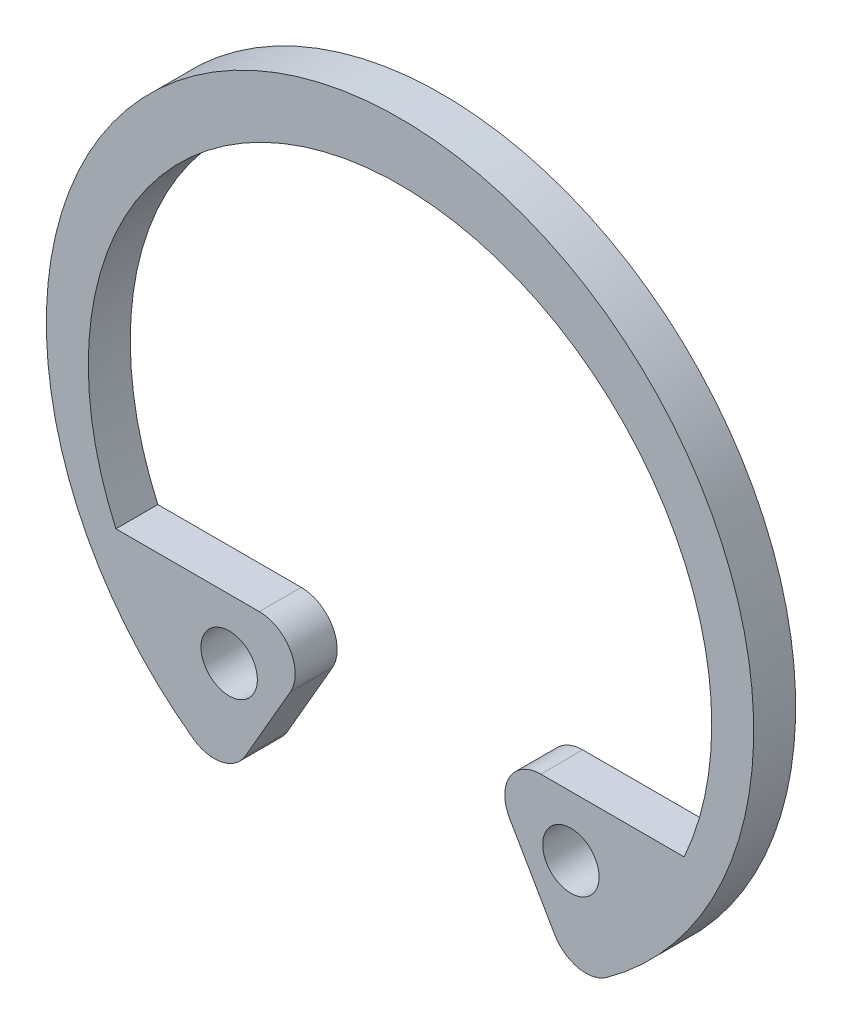
ISO-10303-21;
HEADER;
FILE_DESCRIPTION(('STEP AP214'),'2;1');
FILE_NAME('part.step','',(''),(''),'','','');
FILE_SCHEMA(('AUTOMOTIVE_DESIGN { 1 0 10303 214 1 1 1 1 }'));
ENDSEC;
DATA;
#1=APPLICATION_CONTEXT('core data for automotive mechanical design processes');
#2=APPLICATION_PROTOCOL_DEFINITION('international standard','automotive_design',2000,#1);
#3=PRODUCT_CONTEXT('',#1,'mechanical');
#4=PRODUCT('Part','Part','',(#3));
#5=PRODUCT_RELATED_PRODUCT_CATEGORY('part','',(#4));
#6=PRODUCT_DEFINITION_FORMATION('','',#4);
#7=PRODUCT_DEFINITION_CONTEXT('part definition',#1,'design');
#8=PRODUCT_DEFINITION('design','',#6,#7);
#9=PRODUCT_DEFINITION_SHAPE('','',#8);
#10=(LENGTH_UNIT() NAMED_UNIT(*) SI_UNIT(.MILLI.,.METRE.));
#11=(NAMED_UNIT(*) PLANE_ANGLE_UNIT() SI_UNIT($,.RADIAN.));
#12=(NAMED_UNIT(*) SI_UNIT($,.STERADIAN.) SOLID_ANGLE_UNIT());
#13=UNCERTAINTY_MEASURE_WITH_UNIT(LENGTH_MEASURE(1.E-05),#10,'distance_accuracy_value','');
#14=(GEOMETRIC_REPRESENTATION_CONTEXT(3) GLOBAL_UNCERTAINTY_ASSIGNED_CONTEXT((#13)) GLOBAL_UNIT_ASSIGNED_CONTEXT((#10,
#11,#12)) REPRESENTATION_CONTEXT('',''));
#15=CARTESIAN_POINT('',(0.,0.,0.));
#16=DIRECTION('',(0.,0.,1.));
#17=DIRECTION('',(1.,0.,0.));
#18=AXIS2_PLACEMENT_3D('',#15,#16,#17);
#19=CARTESIAN_POINT('',(0.,-0.3302,-0.889));
#20=DIRECTION('',(0.,0.,1.));
#21=DIRECTION('',(1.,0.,0.));
#22=AXIS2_PLACEMENT_3D('',#19,#20,#21);
#23=CYLINDRICAL_SURFACE('',#22,6.604);
#24=CARTESIAN_POINT('',(0.,-0.3302,0.));
#25=DIRECTION('',(0.,0.,-1.));
#26=DIRECTION('',(1.,0.,0.));
#27=AXIS2_PLACEMENT_3D('',#24,#25,#26);
#28=CIRCLE('',#27,6.604);
#29=CARTESIAN_POINT('',(-6.01883536574976,-3.048,0.));
#30=VERTEX_POINT('',#29);
#31=CARTESIAN_POINT('',(6.01883536574976,-3.048,0.));
#32=VERTEX_POINT('',#31);
#33=EDGE_CURVE('E143',#30,#32,#28,.T.);
#34=ORIENTED_EDGE('',*,*,#33,.F.);
#35=DIRECTION('',(0.,0.,1.));
#36=VECTOR('',#35,1.);
#37=CARTESIAN_POINT('',(-6.01883536574976,-3.048,-0.889));
#38=LINE('',#37,#36);
#39=CARTESIAN_POINT('',(-6.01883536574976,-3.048,-0.889));
#40=VERTEX_POINT('',#39);
#41=EDGE_CURVE('E11',#40,#30,#38,.T.);
#42=ORIENTED_EDGE('',*,*,#41,.F.);
#43=CARTESIAN_POINT('',(0.,-0.3302,-0.889));
#44=DIRECTION('',(0.,0.,-1.));
#45=DIRECTION('',(1.,0.,0.));
#46=AXIS2_PLACEMENT_3D('',#43,#44,#45);
#47=CIRCLE('',#46,6.604);
#48=CARTESIAN_POINT('',(6.01883536574976,-3.048,-0.889));
#49=VERTEX_POINT('',#48);
#50=EDGE_CURVE('E170',#40,#49,#47,.T.);
#51=ORIENTED_EDGE('',*,*,#50,.T.);
#52=DIRECTION('',(0.,0.,1.));
#53=VECTOR('',#52,1.);
#54=CARTESIAN_POINT('',(6.01883536574976,-3.048,-0.889));
#55=LINE('',#54,#53);
#56=EDGE_CURVE('E37',#49,#32,#55,.T.);
#57=ORIENTED_EDGE('',*,*,#56,.T.);
#58=EDGE_LOOP('',(#34,#42,#51,#57));
#59=FACE_BOUND('',#58,.T.);
#60=ADVANCED_FACE('F34',(#59),#23,.F.);
#61=CARTESIAN_POINT('',(-6.01883536574976,-3.048,-0.889));
#62=DIRECTION('',(0.,1.,0.));
#63=DIRECTION('',(-1.,0.,0.));
#64=AXIS2_PLACEMENT_3D('',#61,#62,#63);
#65=PLANE('',#64);
#66=DIRECTION('',(-1.,0.,0.));
#67=VECTOR('',#66,1.);
#68=CARTESIAN_POINT('',(-6.01883536574976,-3.048,0.));
#69=LINE('',#68,#67);
#70=CARTESIAN_POINT('',(-2.98174578531465,-3.04800000000002,0.));
#71=VERTEX_POINT('',#70);
#72=EDGE_CURVE('E168',#71,#30,#69,.T.);
#73=ORIENTED_EDGE('',*,*,#72,.F.);
#74=DIRECTION('',(0.,0.,1.));
#75=VECTOR('',#74,1.);
#76=CARTESIAN_POINT('',(-2.98174578531465,-3.04800000000002,-0.889));
#77=LINE('',#76,#75);
#78=CARTESIAN_POINT('',(-2.98174578531465,-3.04800000000002,-0.889));
#79=VERTEX_POINT('',#78);
#80=EDGE_CURVE('E43',#79,#71,#77,.T.);
#81=ORIENTED_EDGE('',*,*,#80,.F.);
#82=DIRECTION('',(-1.,0.,0.));
#83=VECTOR('',#82,1.);
#84=CARTESIAN_POINT('',(-6.01883536574976,-3.048,-0.889));
#85=LINE('',#84,#83);
#86=EDGE_CURVE('E133',#79,#40,#85,.T.);
#87=ORIENTED_EDGE('',*,*,#86,.T.);
#88=ORIENTED_EDGE('',*,*,#41,.T.);
#89=EDGE_LOOP('',(#73,#81,#87,#88));
#90=FACE_BOUND('',#89,.T.);
#91=ADVANCED_FACE('F186',(#90),#65,.T.);
#92=CARTESIAN_POINT('',(-2.98174578531465,-3.81,-0.889));
#93=DIRECTION('',(0.,0.,1.));
#94=DIRECTION('',(1.,0.,0.));
#95=AXIS2_PLACEMENT_3D('',#92,#93,#94);
#96=CYLINDRICAL_SURFACE('',#95,0.76199999999998);
#97=CARTESIAN_POINT('',(-2.98174578531465,-3.81,0.));
#98=DIRECTION('',(0.,0.,1.));
#99=DIRECTION('',(-1.,0.,0.));
#100=AXIS2_PLACEMENT_3D('',#97,#98,#99);
#101=CIRCLE('',#100,0.76199999999998);
#102=CARTESIAN_POINT('',(-2.32183442763095,-4.19099999999998,0.));
#103=VERTEX_POINT('',#102);
#104=EDGE_CURVE('E120',#103,#71,#101,.T.);
#105=ORIENTED_EDGE('',*,*,#104,.F.);
#106=DIRECTION('',(0.,0.,1.));
#107=VECTOR('',#106,1.);
#108=CARTESIAN_POINT('',(-2.32183442763095,-4.19099999999998,-0.889));
#109=LINE('',#108,#107);
#110=CARTESIAN_POINT('',(-2.32183442763095,-4.19099999999998,-0.889));
#111=VERTEX_POINT('',#110);
#112=EDGE_CURVE('E115',#111,#103,#109,.T.);
#113=ORIENTED_EDGE('',*,*,#112,.F.);
#114=CARTESIAN_POINT('',(-2.98174578531465,-3.81,-0.889));
#115=DIRECTION('',(0.,0.,1.));
#116=DIRECTION('',(-1.,0.,0.));
#117=AXIS2_PLACEMENT_3D('',#114,#115,#116);
#118=CIRCLE('',#117,0.76199999999998);
#119=EDGE_CURVE('E118',#111,#79,#118,.T.);
#120=ORIENTED_EDGE('',*,*,#119,.T.);
#121=ORIENTED_EDGE('',*,*,#80,.T.);
#122=EDGE_LOOP('',(#105,#113,#120,#121));
#123=FACE_BOUND('',#122,.T.);
#124=ADVANCED_FACE('F117',(#123),#96,.T.);
#125=CARTESIAN_POINT('',(-2.32183442763095,-4.19099999999998,-0.889));
#126=DIRECTION('',(0.866025403784436,-0.500000000000004,0.));
#127=DIRECTION('',(0.500000000000005,0.866025403784436,0.));
#128=AXIS2_PLACEMENT_3D('',#125,#126,#127);
#129=PLANE('',#128);
#130=DIRECTION('',(0.500000000000005,0.866025403784436,0.));
#131=VECTOR('',#130,1.);
#132=CARTESIAN_POINT('',(-2.32183442763095,-4.19099999999998,0.));
#133=LINE('',#132,#131);
#134=CARTESIAN_POINT('',(-3.27503972206301,-5.84199999999999,0.));
#135=VERTEX_POINT('',#134);
#136=EDGE_CURVE('E165',#135,#103,#133,.T.);
#137=ORIENTED_EDGE('',*,*,#136,.F.);
#138=DIRECTION('',(0.,0.,1.));
#139=VECTOR('',#138,1.);
#140=CARTESIAN_POINT('',(-3.27503972206301,-5.84199999999999,-0.889));
#141=LINE('',#140,#139);
#142=CARTESIAN_POINT('',(-3.27503972206301,-5.84199999999999,-0.889));
#143=VERTEX_POINT('',#142);
#144=EDGE_CURVE('E125',#143,#135,#141,.T.);
#145=ORIENTED_EDGE('',*,*,#144,.F.);
#146=DIRECTION('',(0.500000000000005,0.866025403784436,0.));
#147=VECTOR('',#146,1.);
#148=CARTESIAN_POINT('',(-2.32183442763095,-4.19099999999998,-0.889));
#149=LINE('',#148,#147);
#150=EDGE_CURVE('E131',#143,#111,#149,.T.);
#151=ORIENTED_EDGE('',*,*,#150,.T.);
#152=ORIENTED_EDGE('',*,*,#112,.T.);
#153=EDGE_LOOP('',(#137,#145,#151,#152));
#154=FACE_BOUND('',#153,.T.);
#155=ADVANCED_FACE('F135',(#154),#129,.T.);
#156=CARTESIAN_POINT('',(-3.93495107974674,-5.461,-0.889));
#157=DIRECTION('',(0.,0.,1.));
#158=DIRECTION('',(1.,0.,0.));
#159=AXIS2_PLACEMENT_3D('',#156,#157,#158);
#160=CYLINDRICAL_SURFACE('',#159,0.76199999999998);
#161=CARTESIAN_POINT('',(-3.93495107974674,-5.461,0.));
#162=DIRECTION('',(0.,0.,1.));
#163=DIRECTION('',(-1.,0.,0.));
#164=AXIS2_PLACEMENT_3D('',#161,#162,#163);
#165=CIRCLE('',#164,0.76199999999998);
#166=CARTESIAN_POINT('',(-4.38041723971807,-6.07922641509434,0.));
#167=VERTEX_POINT('',#166);
#168=EDGE_CURVE('E162',#167,#135,#165,.T.);
#169=ORIENTED_EDGE('',*,*,#168,.F.);
#170=DIRECTION('',(0.,0.,1.));
#171=VECTOR('',#170,1.);
#172=CARTESIAN_POINT('',(-4.38041723971807,-6.07922641509434,-0.889));
#173=LINE('',#172,#171);
#174=CARTESIAN_POINT('',(-4.38041723971807,-6.07922641509434,-0.889));
#175=VERTEX_POINT('',#174);
#176=EDGE_CURVE('E174',#175,#167,#173,.T.);
#177=ORIENTED_EDGE('',*,*,#176,.F.);
#178=CARTESIAN_POINT('',(-3.93495107974674,-5.461,-0.889));
#179=DIRECTION('',(0.,0.,1.));
#180=DIRECTION('',(-1.,0.,0.));
#181=AXIS2_PLACEMENT_3D('',#178,#179,#180);
#182=CIRCLE('',#181,0.76199999999998);
#183=EDGE_CURVE('E136',#175,#143,#182,.T.);
#184=ORIENTED_EDGE('',*,*,#183,.T.);
#185=ORIENTED_EDGE('',*,*,#144,.T.);
#186=EDGE_LOOP('',(#169,#177,#184,#185));
#187=FACE_BOUND('',#186,.T.);
#188=ADVANCED_FACE('F199',(#187),#160,.T.);
#189=CARTESIAN_POINT('',(0.,0.,-0.889));
#190=DIRECTION('',(0.,0.,1.));
#191=DIRECTION('',(1.,0.,0.));
#192=AXIS2_PLACEMENT_3D('',#189,#190,#191);
#193=CYLINDRICAL_SURFACE('',#192,7.493);
#194=CARTESIAN_POINT('',(0.,0.,0.));
#195=DIRECTION('',(0.,0.,1.));
#196=DIRECTION('',(1.,0.,0.));
#197=AXIS2_PLACEMENT_3D('',#194,#195,#196);
#198=CIRCLE('',#197,7.493);
#199=CARTESIAN_POINT('',(4.38041723971807,-6.07922641509434,0.));
#200=VERTEX_POINT('',#199);
#201=EDGE_CURVE('E159',#200,#167,#198,.T.);
#202=ORIENTED_EDGE('',*,*,#201,.F.);
#203=DIRECTION('',(0.,0.,1.));
#204=VECTOR('',#203,1.);
#205=CARTESIAN_POINT('',(4.38041723971807,-6.07922641509434,-0.889));
#206=LINE('',#205,#204);
#207=CARTESIAN_POINT('',(4.38041723971807,-6.07922641509434,-0.889));
#208=VERTEX_POINT('',#207);
#209=EDGE_CURVE('E176',#208,#200,#206,.T.);
#210=ORIENTED_EDGE('',*,*,#209,.F.);
#211=CARTESIAN_POINT('',(0.,0.,-0.889));
#212=DIRECTION('',(0.,0.,1.));
#213=DIRECTION('',(1.,0.,0.));
#214=AXIS2_PLACEMENT_3D('',#211,#212,#213);
#215=CIRCLE('',#214,7.493);
#216=EDGE_CURVE('E138',#208,#175,#215,.T.);
#217=ORIENTED_EDGE('',*,*,#216,.T.);
#218=ORIENTED_EDGE('',*,*,#176,.T.);
#219=EDGE_LOOP('',(#202,#210,#217,#218));
#220=FACE_BOUND('',#219,.T.);
#221=ADVANCED_FACE('F202',(#220),#193,.T.);
#222=CARTESIAN_POINT('',(3.93495107974674,-5.461,-0.889));
#223=DIRECTION('',(0.,0.,1.));
#224=DIRECTION('',(1.,0.,0.));
#225=AXIS2_PLACEMENT_3D('',#222,#223,#224);
#226=CYLINDRICAL_SURFACE('',#225,0.762000000000001);
#227=CARTESIAN_POINT('',(3.93495107974674,-5.461,0.));
#228=DIRECTION('',(0.,0.,1.));
#229=DIRECTION('',(1.,0.,0.));
#230=AXIS2_PLACEMENT_3D('',#227,#228,#229);
#231=CIRCLE('',#230,0.762000000000001);
#232=CARTESIAN_POINT('',(3.275039722063,-5.842,0.));
#233=VERTEX_POINT('',#232);
#234=EDGE_CURVE('E156',#233,#200,#231,.T.);
#235=ORIENTED_EDGE('',*,*,#234,.F.);
#236=DIRECTION('',(0.,0.,1.));
#237=VECTOR('',#236,1.);
#238=CARTESIAN_POINT('',(3.275039722063,-5.842,-0.889));
#239=LINE('',#238,#237);
#240=CARTESIAN_POINT('',(3.275039722063,-5.842,-0.889));
#241=VERTEX_POINT('',#240);
#242=EDGE_CURVE('E178',#241,#233,#239,.T.);
#243=ORIENTED_EDGE('',*,*,#242,.F.);
#244=CARTESIAN_POINT('',(3.93495107974674,-5.461,-0.889));
#245=DIRECTION('',(0.,0.,1.));
#246=DIRECTION('',(1.,0.,0.));
#247=AXIS2_PLACEMENT_3D('',#244,#245,#246);
#248=CIRCLE('',#247,0.762000000000001);
#249=EDGE_CURVE('E262',#241,#208,#248,.T.);
#250=ORIENTED_EDGE('',*,*,#249,.T.);
#251=ORIENTED_EDGE('',*,*,#209,.T.);
#252=EDGE_LOOP('',(#235,#243,#250,#251));
#253=FACE_BOUND('',#252,.T.);
#254=ADVANCED_FACE('F206',(#253),#226,.T.);
#255=CARTESIAN_POINT('',(2.32183442763091,-4.191,-0.889));
#256=DIRECTION('',(-0.866025403784436,-0.500000000000004,0.));
#257=DIRECTION('',(0.500000000000004,-0.866025403784436,0.));
#258=AXIS2_PLACEMENT_3D('',#255,#256,#257);
#259=PLANE('',#258);
#260=DIRECTION('',(0.500000000000004,-0.866025403784436,0.));
#261=VECTOR('',#260,1.);
#262=CARTESIAN_POINT('',(2.32183442763091,-4.191,0.));
#263=LINE('',#262,#261);
#264=CARTESIAN_POINT('',(2.32183442763091,-4.191,0.));
#265=VERTEX_POINT('',#264);
#266=EDGE_CURVE('E153',#265,#233,#263,.T.);
#267=ORIENTED_EDGE('',*,*,#266,.F.);
#268=DIRECTION('',(0.,0.,1.));
#269=VECTOR('',#268,1.);
#270=CARTESIAN_POINT('',(2.32183442763091,-4.191,-0.889));
#271=LINE('',#270,#269);
#272=CARTESIAN_POINT('',(2.32183442763091,-4.191,-0.889));
#273=VERTEX_POINT('',#272);
#274=EDGE_CURVE('E180',#273,#265,#271,.T.);
#275=ORIENTED_EDGE('',*,*,#274,.F.);
#276=DIRECTION('',(0.500000000000004,-0.866025403784436,0.));
#277=VECTOR('',#276,1.);
#278=CARTESIAN_POINT('',(2.32183442763091,-4.191,-0.889));
#279=LINE('',#278,#277);
#280=EDGE_CURVE('E259',#273,#241,#279,.T.);
#281=ORIENTED_EDGE('',*,*,#280,.T.);
#282=ORIENTED_EDGE('',*,*,#242,.T.);
#283=EDGE_LOOP('',(#267,#275,#281,#282));
#284=FACE_BOUND('',#283,.T.);
#285=ADVANCED_FACE('F210',(#284),#259,.T.);
#286=CARTESIAN_POINT('',(2.98174578531465,-3.81,-0.889));
#287=DIRECTION('',(0.,0.,1.));
#288=DIRECTION('',(1.,0.,0.));
#289=AXIS2_PLACEMENT_3D('',#286,#287,#288);
#290=CYLINDRICAL_SURFACE('',#289,0.762);
#291=CARTESIAN_POINT('',(2.98174578531465,-3.81,0.));
#292=DIRECTION('',(0.,0.,1.));
#293=DIRECTION('',(1.,0.,0.));
#294=AXIS2_PLACEMENT_3D('',#291,#292,#293);
#295=CIRCLE('',#294,0.762);
#296=CARTESIAN_POINT('',(2.98174578531465,-3.048,0.));
#297=VERTEX_POINT('',#296);
#298=EDGE_CURVE('E150',#297,#265,#295,.T.);
#299=ORIENTED_EDGE('',*,*,#298,.F.);
#300=DIRECTION('',(0.,0.,1.));
#301=VECTOR('',#300,1.);
#302=CARTESIAN_POINT('',(2.98174578531465,-3.048,-0.889));
#303=LINE('',#302,#301);
#304=CARTESIAN_POINT('',(2.98174578531465,-3.048,-0.889));
#305=VERTEX_POINT('',#304);
#306=EDGE_CURVE('E181',#305,#297,#303,.T.);
#307=ORIENTED_EDGE('',*,*,#306,.F.);
#308=CARTESIAN_POINT('',(2.98174578531465,-3.81,-0.889));
#309=DIRECTION('',(0.,0.,1.));
#310=DIRECTION('',(1.,0.,0.));
#311=AXIS2_PLACEMENT_3D('',#308,#309,#310);
#312=CIRCLE('',#311,0.762);
#313=EDGE_CURVE('E256',#305,#273,#312,.T.);
#314=ORIENTED_EDGE('',*,*,#313,.T.);
#315=ORIENTED_EDGE('',*,*,#274,.T.);
#316=EDGE_LOOP('',(#299,#307,#314,#315));
#317=FACE_BOUND('',#316,.T.);
#318=ADVANCED_FACE('F214',(#317),#290,.T.);
#319=CARTESIAN_POINT('',(6.01883536574976,-3.048,-0.889));
#320=DIRECTION('',(0.,1.,0.));
#321=DIRECTION('',(-1.,0.,0.));
#322=AXIS2_PLACEMENT_3D('',#319,#320,#321);
#323=PLANE('',#322);
#324=DIRECTION('',(-1.,0.,0.));
#325=VECTOR('',#324,1.);
#326=CARTESIAN_POINT('',(6.01883536574976,-3.048,0.));
#327=LINE('',#326,#325);
#328=EDGE_CURVE('E146',#32,#297,#327,.T.);
#329=ORIENTED_EDGE('',*,*,#328,.F.);
#330=ORIENTED_EDGE('',*,*,#56,.F.);
#331=DIRECTION('',(-1.,0.,0.));
#332=VECTOR('',#331,1.);
#333=CARTESIAN_POINT('',(6.01883536574976,-3.048,-0.889));
#334=LINE('',#333,#332);
#335=EDGE_CURVE('E254',#49,#305,#334,.T.);
#336=ORIENTED_EDGE('',*,*,#335,.T.);
#337=ORIENTED_EDGE('',*,*,#306,.T.);
#338=EDGE_LOOP('',(#329,#330,#336,#337));
#339=FACE_BOUND('',#338,.T.);
#340=ADVANCED_FACE('F183',(#339),#323,.T.);
#341=CARTESIAN_POINT('',(0.,-0.3302,-0.889));
#342=DIRECTION('',(0.,0.,1.));
#343=DIRECTION('',(1.,0.,0.));
#344=AXIS2_PLACEMENT_3D('',#341,#342,#343);
#345=PLANE('',#344);
#346=CARTESIAN_POINT('',(-3.6195,-4.318,-0.889));
#347=DIRECTION('',(0.,0.,1.));
#348=DIRECTION('',(-1.,0.,0.));
#349=AXIS2_PLACEMENT_3D('',#346,#347,#348);
#350=CIRCLE('',#349,0.5969);
#351=CARTESIAN_POINT('',(-4.2164,-4.318,-0.889));
#352=VERTEX_POINT('',#351);
#353=EDGE_CURVE('E241',#352,#352,#350,.T.);
#354=ORIENTED_EDGE('',*,*,#353,.T.);
#355=EDGE_LOOP('',(#354));
#356=FACE_BOUND('',#355,.T.);
#357=CARTESIAN_POINT('',(3.6195,-4.318,-0.889));
#358=DIRECTION('',(0.,0.,1.));
#359=DIRECTION('',(1.,0.,0.));
#360=AXIS2_PLACEMENT_3D('',#357,#358,#359);
#361=CIRCLE('',#360,0.5969);
#362=CARTESIAN_POINT('',(4.2164,-4.318,-0.889));
#363=VERTEX_POINT('',#362);
#364=EDGE_CURVE('E147',#363,#363,#361,.T.);
#365=ORIENTED_EDGE('',*,*,#364,.T.);
#366=EDGE_LOOP('',(#365));
#367=FACE_BOUND('',#366,.T.);
#368=ORIENTED_EDGE('',*,*,#50,.F.);
#369=ORIENTED_EDGE('',*,*,#86,.F.);
#370=ORIENTED_EDGE('',*,*,#119,.F.);
#371=ORIENTED_EDGE('',*,*,#150,.F.);
#372=ORIENTED_EDGE('',*,*,#183,.F.);
#373=ORIENTED_EDGE('',*,*,#216,.F.);
#374=ORIENTED_EDGE('',*,*,#249,.F.);
#375=ORIENTED_EDGE('',*,*,#280,.F.);
#376=ORIENTED_EDGE('',*,*,#313,.F.);
#377=ORIENTED_EDGE('',*,*,#335,.F.);
#378=EDGE_LOOP('',(#368,#369,#370,#371,#372,#373,#374,#375,#376,#377));
#379=FACE_BOUND('',#378,.T.);
#380=ADVANCED_FACE('F129',(#356,#367,#379),#345,.F.);
#381=CARTESIAN_POINT('',(0.,-0.3302,0.));
#382=DIRECTION('',(0.,0.,1.));
#383=DIRECTION('',(1.,0.,0.));
#384=AXIS2_PLACEMENT_3D('',#381,#382,#383);
#385=PLANE('',#384);
#386=CARTESIAN_POINT('',(-3.6195,-4.318,0.));
#387=DIRECTION('',(0.,0.,1.));
#388=DIRECTION('',(-1.,0.,0.));
#389=AXIS2_PLACEMENT_3D('',#386,#387,#388);
#390=CIRCLE('',#389,0.5969);
#391=CARTESIAN_POINT('',(-4.2164,-4.318,0.));
#392=VERTEX_POINT('',#391);
#393=EDGE_CURVE('E244',#392,#392,#390,.T.);
#394=ORIENTED_EDGE('',*,*,#393,.F.);
#395=EDGE_LOOP('',(#394));
#396=FACE_BOUND('',#395,.T.);
#397=CARTESIAN_POINT('',(3.6195,-4.318,0.));
#398=DIRECTION('',(0.,0.,1.));
#399=DIRECTION('',(1.,0.,0.));
#400=AXIS2_PLACEMENT_3D('',#397,#398,#399);
#401=CIRCLE('',#400,0.5969);
#402=CARTESIAN_POINT('',(4.2164,-4.318,0.));
#403=VERTEX_POINT('',#402);
#404=EDGE_CURVE('E246',#403,#403,#401,.T.);
#405=ORIENTED_EDGE('',*,*,#404,.F.);
#406=EDGE_LOOP('',(#405));
#407=FACE_BOUND('',#406,.T.);
#408=ORIENTED_EDGE('',*,*,#33,.T.);
#409=ORIENTED_EDGE('',*,*,#328,.T.);
#410=ORIENTED_EDGE('',*,*,#298,.T.);
#411=ORIENTED_EDGE('',*,*,#266,.T.);
#412=ORIENTED_EDGE('',*,*,#234,.T.);
#413=ORIENTED_EDGE('',*,*,#201,.T.);
#414=ORIENTED_EDGE('',*,*,#168,.T.);
#415=ORIENTED_EDGE('',*,*,#136,.T.);
#416=ORIENTED_EDGE('',*,*,#104,.T.);
#417=ORIENTED_EDGE('',*,*,#72,.T.);
#418=EDGE_LOOP('',(#408,#409,#410,#411,#412,#413,#414,#415,#416,#417));
#419=FACE_BOUND('',#418,.T.);
#420=ADVANCED_FACE('F185',(#396,#407,#419),#385,.T.);
#421=CARTESIAN_POINT('',(3.6195,-4.318,-0.889));
#422=DIRECTION('',(0.,0.,1.));
#423=DIRECTION('',(1.,0.,0.));
#424=AXIS2_PLACEMENT_3D('',#421,#422,#423);
#425=CYLINDRICAL_SURFACE('',#424,0.5969);
#426=ORIENTED_EDGE('',*,*,#364,.F.);
#427=EDGE_LOOP('',(#426));
#428=FACE_BOUND('',#427,.T.);
#429=ORIENTED_EDGE('',*,*,#404,.T.);
#430=EDGE_LOOP('',(#429));
#431=FACE_BOUND('',#430,.T.);
#432=ADVANCED_FACE('F226',(#428,#431),#425,.F.);
#433=CARTESIAN_POINT('',(-3.6195,-4.318,-0.889));
#434=DIRECTION('',(0.,0.,1.));
#435=DIRECTION('',(1.,0.,0.));
#436=AXIS2_PLACEMENT_3D('',#433,#434,#435);
#437=CYLINDRICAL_SURFACE('',#436,0.5969);
#438=ORIENTED_EDGE('',*,*,#353,.F.);
#439=EDGE_LOOP('',(#438));
#440=FACE_BOUND('',#439,.T.);
#441=ORIENTED_EDGE('',*,*,#393,.T.);
#442=EDGE_LOOP('',(#441));
#443=FACE_BOUND('',#442,.T.);
#444=ADVANCED_FACE('F233',(#440,#443),#437,.F.);
#445=CLOSED_SHELL('',(#60,#91,#124,#155,#188,#221,#254,#285,#318,#340,#380,#420,#432,#444));
#446=MANIFOLD_SOLID_BREP('B2',#445);
#447=ADVANCED_BREP_SHAPE_REPRESENTATION('',(#18,#446),#14);
#448=SHAPE_DEFINITION_REPRESENTATION(#9,#447);
ENDSEC;
END-ISO-10303-21;
